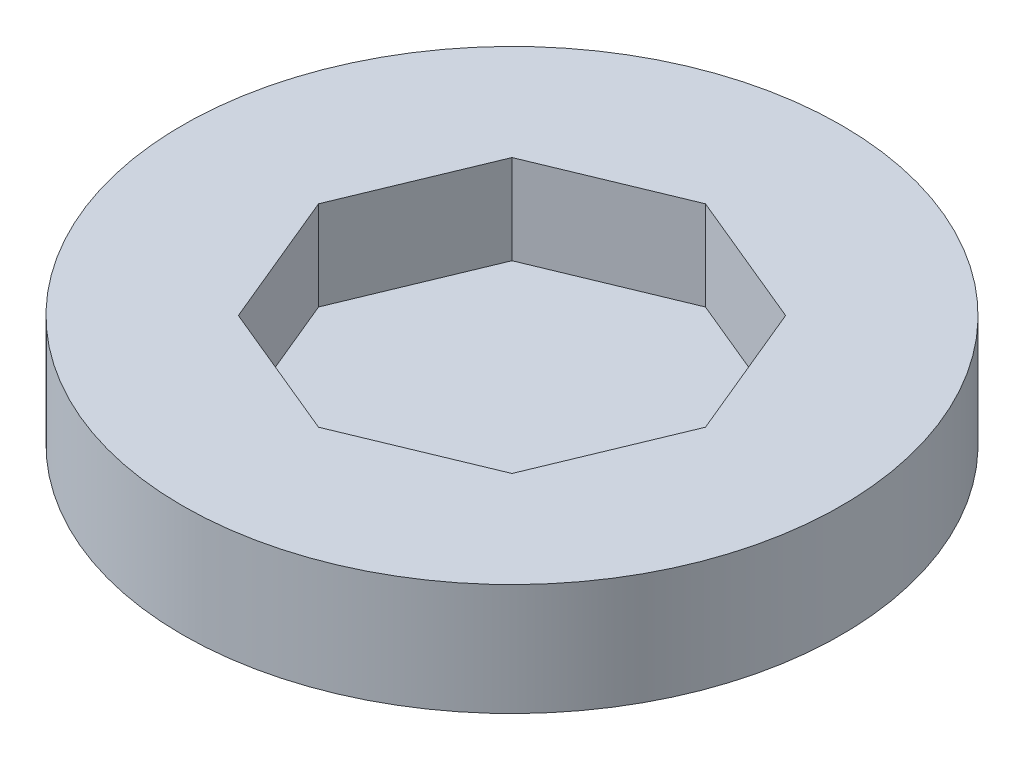
ISO-10303-21;
HEADER;
FILE_DESCRIPTION(('STEP AP214'),'2;1');
FILE_NAME('part.step','',(''),(''),'','','');
FILE_SCHEMA(('AUTOMOTIVE_DESIGN { 1 0 10303 214 1 1 1 1 }'));
ENDSEC;
DATA;
#1=APPLICATION_CONTEXT('core data for automotive mechanical design processes');
#2=APPLICATION_PROTOCOL_DEFINITION('international standard','automotive_design',2000,#1);
#3=PRODUCT_CONTEXT('',#1,'mechanical');
#4=PRODUCT('Part','Part','',(#3));
#5=PRODUCT_RELATED_PRODUCT_CATEGORY('part','',(#4));
#6=PRODUCT_DEFINITION_FORMATION('','',#4);
#7=PRODUCT_DEFINITION_CONTEXT('part definition',#1,'design');
#8=PRODUCT_DEFINITION('design','',#6,#7);
#9=PRODUCT_DEFINITION_SHAPE('','',#8);
#10=(LENGTH_UNIT() NAMED_UNIT(*) SI_UNIT(.MILLI.,.METRE.));
#11=(NAMED_UNIT(*) PLANE_ANGLE_UNIT() SI_UNIT($,.RADIAN.));
#12=(NAMED_UNIT(*) SI_UNIT($,.STERADIAN.) SOLID_ANGLE_UNIT());
#13=UNCERTAINTY_MEASURE_WITH_UNIT(LENGTH_MEASURE(1.E-05),#10,'distance_accuracy_value','');
#14=(GEOMETRIC_REPRESENTATION_CONTEXT(3) GLOBAL_UNCERTAINTY_ASSIGNED_CONTEXT((#13)) GLOBAL_UNIT_ASSIGNED_CONTEXT((#10,
#11,#12)) REPRESENTATION_CONTEXT('',''));
#15=CARTESIAN_POINT('',(0.,0.,0.));
#16=DIRECTION('',(0.,0.,1.));
#17=DIRECTION('',(1.,0.,0.));
#18=AXIS2_PLACEMENT_3D('',#15,#16,#17);
#19=CARTESIAN_POINT('',(0.,10.,0.));
#20=DIRECTION('',(0.,-1.,0.));
#21=DIRECTION('',(0.,0.,-1.));
#22=AXIS2_PLACEMENT_3D('',#19,#20,#21);
#23=CYLINDRICAL_SURFACE('',#22,29.5);
#24=CARTESIAN_POINT('',(0.,10.,0.));
#25=DIRECTION('',(0.,1.,0.));
#26=DIRECTION('',(0.,0.,1.));
#27=AXIS2_PLACEMENT_3D('',#24,#25,#26);
#28=CIRCLE('',#27,29.5);
#29=CARTESIAN_POINT('',(0.,10.,29.5));
#30=VERTEX_POINT('',#29);
#31=EDGE_CURVE('E11',#30,#30,#28,.T.);
#32=ORIENTED_EDGE('',*,*,#31,.F.);
#33=EDGE_LOOP('',(#32));
#34=FACE_BOUND('',#33,.T.);
#35=CARTESIAN_POINT('',(0.,0.,0.));
#36=DIRECTION('',(0.,1.,0.));
#37=DIRECTION('',(0.,0.,1.));
#38=AXIS2_PLACEMENT_3D('',#35,#36,#37);
#39=CIRCLE('',#38,29.5);
#40=CARTESIAN_POINT('',(0.,0.,29.5));
#41=VERTEX_POINT('',#40);
#42=EDGE_CURVE('E35',#41,#41,#39,.T.);
#43=ORIENTED_EDGE('',*,*,#42,.T.);
#44=EDGE_LOOP('',(#43));
#45=FACE_BOUND('',#44,.T.);
#46=ADVANCED_FACE('F32',(#34,#45),#23,.T.);
#47=CARTESIAN_POINT('',(0.,10.,0.));
#48=DIRECTION('',(0.,1.,0.));
#49=DIRECTION('',(0.,0.,1.));
#50=AXIS2_PLACEMENT_3D('',#47,#48,#49);
#51=PLANE('',#50);
#52=DIRECTION('',(-0.382683432365169,0.,-0.923879532511254));
#53=VECTOR('',#52,1.);
#54=CARTESIAN_POINT('',(17.3182752046783,10.,-1.48728283052501E-12));
#55=LINE('',#54,#53);
#56=CARTESIAN_POINT('',(17.3182752046783,10.,-1.48728283052501E-12));
#57=VERTEX_POINT('',#56);
#58=CARTESIAN_POINT('',(12.2458698356818,10.,-12.2458698356839));
#59=VERTEX_POINT('',#58);
#60=EDGE_CURVE('E46',#57,#59,#55,.T.);
#61=ORIENTED_EDGE('',*,*,#60,.F.);
#62=DIRECTION('',(0.382683432365011,0.,-0.92387953251132));
#63=VECTOR('',#62,1.);
#64=CARTESIAN_POINT('',(12.2458698356839,10.,12.2458698356818));
#65=LINE('',#64,#63);
#66=CARTESIAN_POINT('',(12.2458698356839,10.,12.2458698356818));
#67=VERTEX_POINT('',#66);
#68=EDGE_CURVE('E147',#67,#57,#65,.T.);
#69=ORIENTED_EDGE('',*,*,#68,.F.);
#70=DIRECTION('',(0.923879532511254,0.,-0.382683432365169));
#71=VECTOR('',#70,1.);
#72=CARTESIAN_POINT('',(1.49095290671148E-12,10.,17.3182752046783));
#73=LINE('',#72,#71);
#74=CARTESIAN_POINT('',(1.49095290671148E-12,10.,17.3182752046783));
#75=VERTEX_POINT('',#74);
#76=EDGE_CURVE('E145',#75,#67,#73,.T.);
#77=ORIENTED_EDGE('',*,*,#76,.F.);
#78=DIRECTION('',(0.923879532511319,0.,0.382683432365011));
#79=VECTOR('',#78,1.);
#80=CARTESIAN_POINT('',(-12.2458698356818,10.,12.2458698356839));
#81=LINE('',#80,#79);
#82=CARTESIAN_POINT('',(-12.2458698356818,10.,12.2458698356839));
#83=VERTEX_POINT('',#82);
#84=EDGE_CURVE('E106',#83,#75,#81,.T.);
#85=ORIENTED_EDGE('',*,*,#84,.F.);
#86=DIRECTION('',(0.38268343236517,0.,0.923879532511254));
#87=VECTOR('',#86,1.);
#88=CARTESIAN_POINT('',(-17.3182752046783,10.,1.4883927423881E-12));
#89=LINE('',#88,#87);
#90=CARTESIAN_POINT('',(-17.3182752046783,10.,1.4883927423881E-12));
#91=VERTEX_POINT('',#90);
#92=EDGE_CURVE('E141',#91,#83,#89,.T.);
#93=ORIENTED_EDGE('',*,*,#92,.F.);
#94=DIRECTION('',(-0.38268343236501,0.,0.92387953251132));
#95=VECTOR('',#94,1.);
#96=CARTESIAN_POINT('',(-12.2458698356839,10.,-12.2458698356818));
#97=LINE('',#96,#95);
#98=CARTESIAN_POINT('',(-12.2458698356839,10.,-12.2458698356818));
#99=VERTEX_POINT('',#98);
#100=EDGE_CURVE('E138',#99,#91,#97,.T.);
#101=ORIENTED_EDGE('',*,*,#100,.F.);
#102=DIRECTION('',(-0.923879532511254,0.,0.382683432365169));
#103=VECTOR('',#102,1.);
#104=CARTESIAN_POINT('',(-1.49355094566121E-12,10.,-17.3182752046783));
#105=LINE('',#104,#103);
#106=CARTESIAN_POINT('',(-1.49355094566121E-12,10.,-17.3182752046783));
#107=VERTEX_POINT('',#106);
#108=EDGE_CURVE('E135',#107,#99,#105,.T.);
#109=ORIENTED_EDGE('',*,*,#108,.F.);
#110=DIRECTION('',(-0.92387953251132,0.,-0.38268343236501));
#111=VECTOR('',#110,1.);
#112=CARTESIAN_POINT('',(12.2458698356818,10.,-12.2458698356839));
#113=LINE('',#112,#111);
#114=EDGE_CURVE('E132',#59,#107,#113,.T.);
#115=ORIENTED_EDGE('',*,*,#114,.F.);
#116=EDGE_LOOP('',(#61,#69,#77,#85,#93,#101,#109,#115));
#117=FACE_BOUND('',#116,.T.);
#118=ORIENTED_EDGE('',*,*,#31,.T.);
#119=EDGE_LOOP('',(#118));
#120=FACE_BOUND('',#119,.T.);
#121=ADVANCED_FACE('F166',(#117,#120),#51,.T.);
#122=CARTESIAN_POINT('',(0.,0.,0.));
#123=DIRECTION('',(0.,1.,0.));
#124=DIRECTION('',(0.,0.,1.));
#125=AXIS2_PLACEMENT_3D('',#122,#123,#124);
#126=PLANE('',#125);
#127=ORIENTED_EDGE('',*,*,#42,.F.);
#128=EDGE_LOOP('',(#127));
#129=FACE_BOUND('',#128,.T.);
#130=ADVANCED_FACE('F193',(#129),#126,.F.);
#131=CARTESIAN_POINT('',(17.3182752046783,2.,-1.48728283052501E-12));
#132=DIRECTION('',(0.923879532511254,0.,-0.382683432365169));
#133=DIRECTION('',(-0.382683432365169,0.,-0.923879532511254));
#134=AXIS2_PLACEMENT_3D('',#131,#132,#133);
#135=PLANE('',#134);
#136=ORIENTED_EDGE('',*,*,#60,.T.);
#137=DIRECTION('',(0.,1.,0.));
#138=VECTOR('',#137,1.);
#139=CARTESIAN_POINT('',(12.2458698356818,2.,-12.2458698356839));
#140=LINE('',#139,#138);
#141=CARTESIAN_POINT('',(12.2458698356818,2.,-12.2458698356839));
#142=VERTEX_POINT('',#141);
#143=EDGE_CURVE('E82',#142,#59,#140,.T.);
#144=ORIENTED_EDGE('',*,*,#143,.F.);
#145=DIRECTION('',(-0.382683432365169,0.,-0.923879532511254));
#146=VECTOR('',#145,1.);
#147=CARTESIAN_POINT('',(17.3182752046783,2.,-1.48728283052501E-12));
#148=LINE('',#147,#146);
#149=CARTESIAN_POINT('',(17.3182752046783,2.,-1.48728283052501E-12));
#150=VERTEX_POINT('',#149);
#151=EDGE_CURVE('E149',#150,#142,#148,.T.);
#152=ORIENTED_EDGE('',*,*,#151,.F.);
#153=DIRECTION('',(0.,1.,0.));
#154=VECTOR('',#153,1.);
#155=CARTESIAN_POINT('',(17.3182752046783,2.,-1.48728283052501E-12));
#156=LINE('',#155,#154);
#157=EDGE_CURVE('E54',#150,#57,#156,.T.);
#158=ORIENTED_EDGE('',*,*,#157,.T.);
#159=EDGE_LOOP('',(#136,#144,#152,#158));
#160=FACE_BOUND('',#159,.T.);
#161=ADVANCED_FACE('F186',(#160),#135,.F.);
#162=CARTESIAN_POINT('',(12.2458698356839,2.,12.2458698356818));
#163=DIRECTION('',(0.92387953251132,0.,0.382683432365011));
#164=DIRECTION('',(0.382683432365011,0.,-0.92387953251132));
#165=AXIS2_PLACEMENT_3D('',#162,#163,#164);
#166=PLANE('',#165);
#167=ORIENTED_EDGE('',*,*,#68,.T.);
#168=ORIENTED_EDGE('',*,*,#157,.F.);
#169=DIRECTION('',(0.382683432365011,0.,-0.92387953251132));
#170=VECTOR('',#169,1.);
#171=CARTESIAN_POINT('',(12.2458698356839,2.,12.2458698356818));
#172=LINE('',#171,#170);
#173=CARTESIAN_POINT('',(12.2458698356839,2.,12.2458698356818));
#174=VERTEX_POINT('',#173);
#175=EDGE_CURVE('E118',#174,#150,#172,.T.);
#176=ORIENTED_EDGE('',*,*,#175,.F.);
#177=DIRECTION('',(0.,1.,0.));
#178=VECTOR('',#177,1.);
#179=CARTESIAN_POINT('',(12.2458698356839,2.,12.2458698356818));
#180=LINE('',#179,#178);
#181=EDGE_CURVE('E110',#174,#67,#180,.T.);
#182=ORIENTED_EDGE('',*,*,#181,.T.);
#183=EDGE_LOOP('',(#167,#168,#176,#182));
#184=FACE_BOUND('',#183,.T.);
#185=ADVANCED_FACE('F184',(#184),#166,.F.);
#186=CARTESIAN_POINT('',(1.49095290671148E-12,2.,17.3182752046783));
#187=DIRECTION('',(0.382683432365169,0.,0.923879532511254));
#188=DIRECTION('',(0.923879532511254,0.,-0.382683432365169));
#189=AXIS2_PLACEMENT_3D('',#186,#187,#188);
#190=PLANE('',#189);
#191=ORIENTED_EDGE('',*,*,#76,.T.);
#192=ORIENTED_EDGE('',*,*,#181,.F.);
#193=DIRECTION('',(0.923879532511254,0.,-0.382683432365169));
#194=VECTOR('',#193,1.);
#195=CARTESIAN_POINT('',(1.49095290671148E-12,2.,17.3182752046783));
#196=LINE('',#195,#194);
#197=CARTESIAN_POINT('',(1.49095290671148E-12,2.,17.3182752046783));
#198=VERTEX_POINT('',#197);
#199=EDGE_CURVE('E114',#198,#174,#196,.T.);
#200=ORIENTED_EDGE('',*,*,#199,.F.);
#201=DIRECTION('',(0.,1.,0.));
#202=VECTOR('',#201,1.);
#203=CARTESIAN_POINT('',(1.49095290671148E-12,2.,17.3182752046783));
#204=LINE('',#203,#202);
#205=EDGE_CURVE('E99',#198,#75,#204,.T.);
#206=ORIENTED_EDGE('',*,*,#205,.T.);
#207=EDGE_LOOP('',(#191,#192,#200,#206));
#208=FACE_BOUND('',#207,.T.);
#209=ADVANCED_FACE('F115',(#208),#190,.F.);
#210=CARTESIAN_POINT('',(-12.2458698356818,2.,12.2458698356839));
#211=DIRECTION('',(-0.382683432365011,0.,0.92387953251132));
#212=DIRECTION('',(0.923879532511319,0.,0.382683432365011));
#213=AXIS2_PLACEMENT_3D('',#210,#211,#212);
#214=PLANE('',#213);
#215=ORIENTED_EDGE('',*,*,#84,.T.);
#216=ORIENTED_EDGE('',*,*,#205,.F.);
#217=DIRECTION('',(0.923879532511319,0.,0.382683432365011));
#218=VECTOR('',#217,1.);
#219=CARTESIAN_POINT('',(-12.2458698356818,2.,12.2458698356839));
#220=LINE('',#219,#218);
#221=CARTESIAN_POINT('',(-12.2458698356818,2.,12.2458698356839));
#222=VERTEX_POINT('',#221);
#223=EDGE_CURVE('E103',#222,#198,#220,.T.);
#224=ORIENTED_EDGE('',*,*,#223,.F.);
#225=DIRECTION('',(0.,1.,0.));
#226=VECTOR('',#225,1.);
#227=CARTESIAN_POINT('',(-12.2458698356818,2.,12.2458698356839));
#228=LINE('',#227,#226);
#229=EDGE_CURVE('E111',#222,#83,#228,.T.);
#230=ORIENTED_EDGE('',*,*,#229,.T.);
#231=EDGE_LOOP('',(#215,#216,#224,#230));
#232=FACE_BOUND('',#231,.T.);
#233=ADVANCED_FACE('F101',(#232),#214,.F.);
#234=CARTESIAN_POINT('',(-17.3182752046783,2.,1.4883927423881E-12));
#235=DIRECTION('',(-0.923879532511254,0.,0.38268343236517));
#236=DIRECTION('',(0.38268343236517,0.,0.923879532511254));
#237=AXIS2_PLACEMENT_3D('',#234,#235,#236);
#238=PLANE('',#237);
#239=ORIENTED_EDGE('',*,*,#92,.T.);
#240=ORIENTED_EDGE('',*,*,#229,.F.);
#241=DIRECTION('',(0.38268343236517,0.,0.923879532511254));
#242=VECTOR('',#241,1.);
#243=CARTESIAN_POINT('',(-17.3182752046783,2.,1.4883927423881E-12));
#244=LINE('',#243,#242);
#245=CARTESIAN_POINT('',(-17.3182752046783,2.,1.4883927423881E-12));
#246=VERTEX_POINT('',#245);
#247=EDGE_CURVE('E124',#246,#222,#244,.T.);
#248=ORIENTED_EDGE('',*,*,#247,.F.);
#249=DIRECTION('',(0.,1.,0.));
#250=VECTOR('',#249,1.);
#251=CARTESIAN_POINT('',(-17.3182752046783,2.,1.4883927423881E-12));
#252=LINE('',#251,#250);
#253=EDGE_CURVE('E153',#246,#91,#252,.T.);
#254=ORIENTED_EDGE('',*,*,#253,.T.);
#255=EDGE_LOOP('',(#239,#240,#248,#254));
#256=FACE_BOUND('',#255,.T.);
#257=ADVANCED_FACE('F183',(#256),#238,.F.);
#258=CARTESIAN_POINT('',(-12.2458698356839,2.,-12.2458698356818));
#259=DIRECTION('',(-0.92387953251132,0.,-0.38268343236501));
#260=DIRECTION('',(-0.38268343236501,0.,0.92387953251132));
#261=AXIS2_PLACEMENT_3D('',#258,#259,#260);
#262=PLANE('',#261);
#263=ORIENTED_EDGE('',*,*,#100,.T.);
#264=ORIENTED_EDGE('',*,*,#253,.F.);
#265=DIRECTION('',(-0.38268343236501,0.,0.92387953251132));
#266=VECTOR('',#265,1.);
#267=CARTESIAN_POINT('',(-12.2458698356839,2.,-12.2458698356818));
#268=LINE('',#267,#266);
#269=CARTESIAN_POINT('',(-12.2458698356839,2.,-12.2458698356818));
#270=VERTEX_POINT('',#269);
#271=EDGE_CURVE('E126',#270,#246,#268,.T.);
#272=ORIENTED_EDGE('',*,*,#271,.F.);
#273=DIRECTION('',(0.,1.,0.));
#274=VECTOR('',#273,1.);
#275=CARTESIAN_POINT('',(-12.2458698356839,2.,-12.2458698356818));
#276=LINE('',#275,#274);
#277=EDGE_CURVE('E155',#270,#99,#276,.T.);
#278=ORIENTED_EDGE('',*,*,#277,.T.);
#279=EDGE_LOOP('',(#263,#264,#272,#278));
#280=FACE_BOUND('',#279,.T.);
#281=ADVANCED_FACE('F181',(#280),#262,.F.);
#282=CARTESIAN_POINT('',(-1.49355094566121E-12,2.,-17.3182752046783));
#283=DIRECTION('',(-0.38268343236517,0.,-0.923879532511254));
#284=DIRECTION('',(-0.923879532511254,0.,0.38268343236517));
#285=AXIS2_PLACEMENT_3D('',#282,#283,#284);
#286=PLANE('',#285);
#287=ORIENTED_EDGE('',*,*,#108,.T.);
#288=ORIENTED_EDGE('',*,*,#277,.F.);
#289=DIRECTION('',(-0.923879532511254,0.,0.382683432365169));
#290=VECTOR('',#289,1.);
#291=CARTESIAN_POINT('',(-1.49355094566121E-12,2.,-17.3182752046783));
#292=LINE('',#291,#290);
#293=CARTESIAN_POINT('',(-1.49355094566121E-12,2.,-17.3182752046783));
#294=VERTEX_POINT('',#293);
#295=EDGE_CURVE('E176',#294,#270,#292,.T.);
#296=ORIENTED_EDGE('',*,*,#295,.F.);
#297=DIRECTION('',(0.,1.,0.));
#298=VECTOR('',#297,1.);
#299=CARTESIAN_POINT('',(-1.49355094566121E-12,2.,-17.3182752046783));
#300=LINE('',#299,#298);
#301=EDGE_CURVE('E157',#294,#107,#300,.T.);
#302=ORIENTED_EDGE('',*,*,#301,.T.);
#303=EDGE_LOOP('',(#287,#288,#296,#302));
#304=FACE_BOUND('',#303,.T.);
#305=ADVANCED_FACE('F172',(#304),#286,.F.);
#306=CARTESIAN_POINT('',(12.2458698356818,2.,-12.2458698356839));
#307=DIRECTION('',(0.38268343236501,0.,-0.92387953251132));
#308=DIRECTION('',(-0.92387953251132,0.,-0.38268343236501));
#309=AXIS2_PLACEMENT_3D('',#306,#307,#308);
#310=PLANE('',#309);
#311=ORIENTED_EDGE('',*,*,#114,.T.);
#312=ORIENTED_EDGE('',*,*,#301,.F.);
#313=DIRECTION('',(-0.92387953251132,0.,-0.38268343236501));
#314=VECTOR('',#313,1.);
#315=CARTESIAN_POINT('',(12.2458698356818,2.,-12.2458698356839));
#316=LINE('',#315,#314);
#317=EDGE_CURVE('E164',#142,#294,#316,.T.);
#318=ORIENTED_EDGE('',*,*,#317,.F.);
#319=ORIENTED_EDGE('',*,*,#143,.T.);
#320=EDGE_LOOP('',(#311,#312,#318,#319));
#321=FACE_BOUND('',#320,.T.);
#322=ADVANCED_FACE('F161',(#321),#310,.F.);
#323=CARTESIAN_POINT('',(0.,2.,0.));
#324=DIRECTION('',(0.,1.,0.));
#325=DIRECTION('',(0.,0.,1.));
#326=AXIS2_PLACEMENT_3D('',#323,#324,#325);
#327=PLANE('',#326);
#328=ORIENTED_EDGE('',*,*,#151,.T.);
#329=ORIENTED_EDGE('',*,*,#317,.T.);
#330=ORIENTED_EDGE('',*,*,#295,.T.);
#331=ORIENTED_EDGE('',*,*,#271,.T.);
#332=ORIENTED_EDGE('',*,*,#247,.T.);
#333=ORIENTED_EDGE('',*,*,#223,.T.);
#334=ORIENTED_EDGE('',*,*,#199,.T.);
#335=ORIENTED_EDGE('',*,*,#175,.T.);
#336=EDGE_LOOP('',(#328,#329,#330,#331,#332,#333,#334,#335));
#337=FACE_BOUND('',#336,.T.);
#338=ADVANCED_FACE('F121',(#337),#327,.T.);
#339=CLOSED_SHELL('',(#46,#121,#130,#161,#185,#209,#233,#257,#281,#305,#322,#338));
#340=MANIFOLD_SOLID_BREP('B2',#339);
#341=ADVANCED_BREP_SHAPE_REPRESENTATION('',(#18,#340),#14);
#342=SHAPE_DEFINITION_REPRESENTATION(#9,#341);
ENDSEC;
END-ISO-10303-21;
